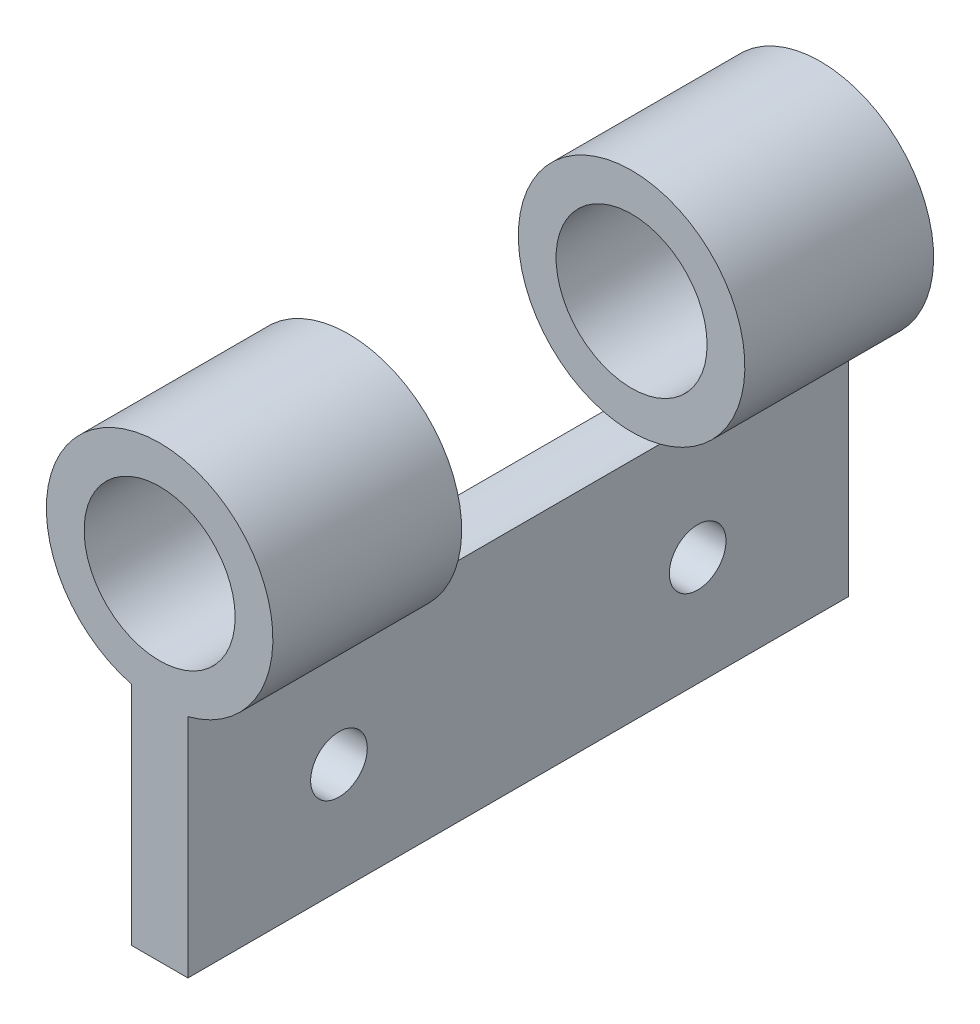
ISO-10303-21;
HEADER;
FILE_DESCRIPTION(('STEP AP214'),'2;1');
FILE_NAME('part.step','',(''),(''),'','','');
FILE_SCHEMA(('AUTOMOTIVE_DESIGN { 1 0 10303 214 1 1 1 1 }'));
ENDSEC;
DATA;
#1=APPLICATION_CONTEXT('core data for automotive mechanical design processes');
#2=APPLICATION_PROTOCOL_DEFINITION('international standard','automotive_design',2000,#1);
#3=PRODUCT_CONTEXT('',#1,'mechanical');
#4=PRODUCT('Part','Part','',(#3));
#5=PRODUCT_RELATED_PRODUCT_CATEGORY('part','',(#4));
#6=PRODUCT_DEFINITION_FORMATION('','',#4);
#7=PRODUCT_DEFINITION_CONTEXT('part definition',#1,'design');
#8=PRODUCT_DEFINITION('design','',#6,#7);
#9=PRODUCT_DEFINITION_SHAPE('','',#8);
#10=(LENGTH_UNIT() NAMED_UNIT(*) SI_UNIT(.MILLI.,.METRE.));
#11=(NAMED_UNIT(*) PLANE_ANGLE_UNIT() SI_UNIT($,.RADIAN.));
#12=(NAMED_UNIT(*) SI_UNIT($,.STERADIAN.) SOLID_ANGLE_UNIT());
#13=UNCERTAINTY_MEASURE_WITH_UNIT(LENGTH_MEASURE(1.E-05),#10,'distance_accuracy_value','');
#14=(GEOMETRIC_REPRESENTATION_CONTEXT(3) GLOBAL_UNCERTAINTY_ASSIGNED_CONTEXT((#13)) GLOBAL_UNIT_ASSIGNED_CONTEXT((#10,
#11,#12)) REPRESENTATION_CONTEXT('',''));
#15=CARTESIAN_POINT('',(0.,0.,0.));
#16=DIRECTION('',(0.,0.,1.));
#17=DIRECTION('',(1.,0.,0.));
#18=AXIS2_PLACEMENT_3D('',#15,#16,#17);
#19=CARTESIAN_POINT('',(0.,0.,-17.5));
#20=DIRECTION('',(0.,0.,1.));
#21=DIRECTION('',(1.,0.,0.));
#22=AXIS2_PLACEMENT_3D('',#19,#20,#21);
#23=CYLINDRICAL_SURFACE('',#22,3.);
#24=DIRECTION('',(0.,0.,1.));
#25=VECTOR('',#24,1.);
#26=CARTESIAN_POINT('',(-0.75,-2.90473750965556,-17.5));
#27=LINE('',#26,#25);
#28=CARTESIAN_POINT('',(-0.75,-2.90473750965556,-17.5));
#29=VERTEX_POINT('',#28);
#30=CARTESIAN_POINT('',(-0.75,-2.90473750965556,-12.5));
#31=VERTEX_POINT('',#30);
#32=EDGE_CURVE('E114',#29,#31,#27,.T.);
#33=ORIENTED_EDGE('',*,*,#32,.T.);
#34=CARTESIAN_POINT('',(0.,0.,-12.5));
#35=DIRECTION('',(0.,0.,1.));
#36=DIRECTION('',(1.,0.,0.));
#37=AXIS2_PLACEMENT_3D('',#34,#35,#36);
#38=CIRCLE('',#37,3.);
#39=CARTESIAN_POINT('',(0.75,-2.90473750965556,-12.5));
#40=VERTEX_POINT('',#39);
#41=EDGE_CURVE('E168',#40,#31,#38,.T.);
#42=ORIENTED_EDGE('',*,*,#41,.F.);
#43=DIRECTION('',(0.,0.,1.));
#44=VECTOR('',#43,1.);
#45=CARTESIAN_POINT('',(0.75,-2.90473750965556,-17.5));
#46=LINE('',#45,#44);
#47=CARTESIAN_POINT('',(0.75,-2.90473750965556,-17.5));
#48=VERTEX_POINT('',#47);
#49=EDGE_CURVE('E12',#48,#40,#46,.T.);
#50=ORIENTED_EDGE('',*,*,#49,.F.);
#51=CARTESIAN_POINT('',(0.,0.,-17.5));
#52=DIRECTION('',(0.,0.,1.));
#53=DIRECTION('',(1.,0.,0.));
#54=AXIS2_PLACEMENT_3D('',#51,#52,#53);
#55=CIRCLE('',#54,3.);
#56=EDGE_CURVE('E177',#48,#29,#55,.T.);
#57=ORIENTED_EDGE('',*,*,#56,.T.);
#58=EDGE_LOOP('',(#33,#42,#50,#57));
#59=FACE_BOUND('',#58,.T.);
#60=ADVANCED_FACE('F60',(#59),#23,.T.);
#61=CARTESIAN_POINT('',(0.,0.,-17.5));
#62=DIRECTION('',(0.,0.,1.));
#63=DIRECTION('',(1.,0.,0.));
#64=AXIS2_PLACEMENT_3D('',#61,#62,#63);
#65=CYLINDRICAL_SURFACE('',#64,2.);
#66=CARTESIAN_POINT('',(0.,0.,-17.5));
#67=DIRECTION('',(0.,0.,1.));
#68=DIRECTION('',(1.,0.,0.));
#69=AXIS2_PLACEMENT_3D('',#66,#67,#68);
#70=CIRCLE('',#69,2.);
#71=CARTESIAN_POINT('',(2.,0.,-17.5));
#72=VERTEX_POINT('',#71);
#73=EDGE_CURVE('E174',#72,#72,#70,.T.);
#74=ORIENTED_EDGE('',*,*,#73,.F.);
#75=EDGE_LOOP('',(#74));
#76=FACE_BOUND('',#75,.T.);
#77=CARTESIAN_POINT('',(0.,0.,-12.5));
#78=DIRECTION('',(0.,0.,1.));
#79=DIRECTION('',(1.,0.,0.));
#80=AXIS2_PLACEMENT_3D('',#77,#78,#79);
#81=CIRCLE('',#80,2.);
#82=CARTESIAN_POINT('',(2.,0.,-12.5));
#83=VERTEX_POINT('',#82);
#84=EDGE_CURVE('E136',#83,#83,#81,.T.);
#85=ORIENTED_EDGE('',*,*,#84,.T.);
#86=EDGE_LOOP('',(#85));
#87=FACE_BOUND('',#86,.T.);
#88=ADVANCED_FACE('F220',(#76,#87),#65,.F.);
#89=CARTESIAN_POINT('',(0.,-8.9,-17.5));
#90=DIRECTION('',(0.,-1.,0.));
#91=DIRECTION('',(0.,0.,-1.));
#92=AXIS2_PLACEMENT_3D('',#89,#90,#91);
#93=PLANE('',#92);
#94=DIRECTION('',(1.,0.,0.));
#95=VECTOR('',#94,1.);
#96=CARTESIAN_POINT('',(0.,-8.9,0.));
#97=LINE('',#96,#95);
#98=CARTESIAN_POINT('',(-0.75,-8.9,0.));
#99=VERTEX_POINT('',#98);
#100=CARTESIAN_POINT('',(0.75,-8.9,0.));
#101=VERTEX_POINT('',#100);
#102=EDGE_CURVE('E191',#99,#101,#97,.T.);
#103=ORIENTED_EDGE('',*,*,#102,.F.);
#104=DIRECTION('',(0.,0.,1.));
#105=VECTOR('',#104,1.);
#106=CARTESIAN_POINT('',(-0.75,-8.9,-17.5));
#107=LINE('',#106,#105);
#108=CARTESIAN_POINT('',(-0.75,-8.9,-17.5));
#109=VERTEX_POINT('',#108);
#110=EDGE_CURVE('E149',#109,#99,#107,.T.);
#111=ORIENTED_EDGE('',*,*,#110,.F.);
#112=DIRECTION('',(1.,0.,0.));
#113=VECTOR('',#112,1.);
#114=CARTESIAN_POINT('',(0.,-8.9,-17.5));
#115=LINE('',#114,#113);
#116=CARTESIAN_POINT('',(0.75,-8.9,-17.5));
#117=VERTEX_POINT('',#116);
#118=EDGE_CURVE('E181',#109,#117,#115,.T.);
#119=ORIENTED_EDGE('',*,*,#118,.T.);
#120=DIRECTION('',(0.,0.,1.));
#121=VECTOR('',#120,1.);
#122=CARTESIAN_POINT('',(0.75,-8.9,-17.5));
#123=LINE('',#122,#121);
#124=EDGE_CURVE('E141',#117,#101,#123,.T.);
#125=ORIENTED_EDGE('',*,*,#124,.T.);
#126=EDGE_LOOP('',(#103,#111,#119,#125));
#127=FACE_BOUND('',#126,.T.);
#128=ADVANCED_FACE('F201',(#127),#93,.T.);
#129=CARTESIAN_POINT('',(0.,0.,0.));
#130=DIRECTION('',(0.,0.,1.));
#131=DIRECTION('',(1.,0.,0.));
#132=AXIS2_PLACEMENT_3D('',#129,#130,#131);
#133=PLANE('',#132);
#134=DIRECTION('',(0.,1.,0.));
#135=VECTOR('',#134,1.);
#136=CARTESIAN_POINT('',(0.75,0.,0.));
#137=LINE('',#136,#135);
#138=CARTESIAN_POINT('',(0.75,-2.90473750965556,0.));
#139=VERTEX_POINT('',#138);
#140=EDGE_CURVE('E146',#101,#139,#137,.T.);
#141=ORIENTED_EDGE('',*,*,#140,.T.);
#142=CARTESIAN_POINT('',(0.,0.,0.));
#143=DIRECTION('',(0.,0.,1.));
#144=DIRECTION('',(1.,0.,0.));
#145=AXIS2_PLACEMENT_3D('',#142,#143,#144);
#146=CIRCLE('',#145,3.);
#147=CARTESIAN_POINT('',(-0.75,-2.90473750965556,0.));
#148=VERTEX_POINT('',#147);
#149=EDGE_CURVE('E139',#139,#148,#146,.T.);
#150=ORIENTED_EDGE('',*,*,#149,.T.);
#151=DIRECTION('',(0.,1.,0.));
#152=VECTOR('',#151,1.);
#153=CARTESIAN_POINT('',(-0.75,0.,0.));
#154=LINE('',#153,#152);
#155=EDGE_CURVE('E189',#99,#148,#154,.T.);
#156=ORIENTED_EDGE('',*,*,#155,.F.);
#157=ORIENTED_EDGE('',*,*,#102,.T.);
#158=EDGE_LOOP('',(#141,#150,#156,#157));
#159=FACE_BOUND('',#158,.T.);
#160=CARTESIAN_POINT('',(0.,0.,0.));
#161=DIRECTION('',(0.,0.,1.));
#162=DIRECTION('',(1.,0.,0.));
#163=AXIS2_PLACEMENT_3D('',#160,#161,#162);
#164=CIRCLE('',#163,2.);
#165=CARTESIAN_POINT('',(2.,0.,0.));
#166=VERTEX_POINT('',#165);
#167=EDGE_CURVE('E171',#166,#166,#164,.T.);
#168=ORIENTED_EDGE('',*,*,#167,.F.);
#169=EDGE_LOOP('',(#168));
#170=FACE_BOUND('',#169,.T.);
#171=ADVANCED_FACE('F196',(#159,#170),#133,.T.);
#172=CARTESIAN_POINT('',(0.75,0.,-17.5));
#173=DIRECTION('',(1.,0.,0.));
#174=DIRECTION('',(0.,0.,-1.));
#175=AXIS2_PLACEMENT_3D('',#172,#173,#174);
#176=PLANE('',#175);
#177=CARTESIAN_POINT('',(0.75,-6.,-4.));
#178=DIRECTION('',(1.,0.,0.));
#179=DIRECTION('',(0.,0.,-1.));
#180=AXIS2_PLACEMENT_3D('',#177,#178,#179);
#181=CIRCLE('',#180,0.75);
#182=CARTESIAN_POINT('',(0.75,-6.,-4.75));
#183=VERTEX_POINT('',#182);
#184=EDGE_CURVE('E154',#183,#183,#181,.T.);
#185=ORIENTED_EDGE('',*,*,#184,.F.);
#186=EDGE_LOOP('',(#185));
#187=FACE_BOUND('',#186,.T.);
#188=CARTESIAN_POINT('',(0.75,-6.,-13.5));
#189=DIRECTION('',(1.,0.,0.));
#190=DIRECTION('',(0.,0.,-1.));
#191=AXIS2_PLACEMENT_3D('',#188,#189,#190);
#192=CIRCLE('',#191,0.75);
#193=CARTESIAN_POINT('',(0.75,-6.,-14.25));
#194=VERTEX_POINT('',#193);
#195=EDGE_CURVE('E159',#194,#194,#192,.T.);
#196=ORIENTED_EDGE('',*,*,#195,.F.);
#197=EDGE_LOOP('',(#196));
#198=FACE_BOUND('',#197,.T.);
#199=ORIENTED_EDGE('',*,*,#140,.F.);
#200=ORIENTED_EDGE('',*,*,#124,.F.);
#201=DIRECTION('',(0.,1.,0.));
#202=VECTOR('',#201,1.);
#203=CARTESIAN_POINT('',(0.75,0.,-17.5));
#204=LINE('',#203,#202);
#205=EDGE_CURVE('E184',#117,#48,#204,.T.);
#206=ORIENTED_EDGE('',*,*,#205,.T.);
#207=ORIENTED_EDGE('',*,*,#49,.T.);
#208=CARTESIAN_POINT('',(0.75,-2.90473750965556,-5.));
#209=VERTEX_POINT('',#208);
#210=EDGE_CURVE('E69',#40,#209,#46,.T.);
#211=ORIENTED_EDGE('',*,*,#210,.T.);
#212=EDGE_CURVE('E71',#209,#139,#46,.T.);
#213=ORIENTED_EDGE('',*,*,#212,.T.);
#214=EDGE_LOOP('',(#199,#200,#206,#207,#211,#213));
#215=FACE_BOUND('',#214,.T.);
#216=ADVANCED_FACE('F142',(#187,#198,#215),#176,.T.);
#217=CARTESIAN_POINT('',(-0.75,0.,-17.5));
#218=DIRECTION('',(1.,0.,0.));
#219=DIRECTION('',(0.,0.,-1.));
#220=AXIS2_PLACEMENT_3D('',#217,#218,#219);
#221=PLANE('',#220);
#222=CARTESIAN_POINT('',(-0.750000000000001,-6.,-4.));
#223=DIRECTION('',(1.,0.,0.));
#224=DIRECTION('',(0.,0.,-1.));
#225=AXIS2_PLACEMENT_3D('',#222,#223,#224);
#226=CIRCLE('',#225,0.75);
#227=CARTESIAN_POINT('',(-0.750000000000001,-6.,-4.75));
#228=VERTEX_POINT('',#227);
#229=EDGE_CURVE('E64',#228,#228,#226,.T.);
#230=ORIENTED_EDGE('',*,*,#229,.T.);
#231=EDGE_LOOP('',(#230));
#232=FACE_BOUND('',#231,.T.);
#233=CARTESIAN_POINT('',(-0.750000000000001,-6.,-13.5));
#234=DIRECTION('',(1.,0.,0.));
#235=DIRECTION('',(0.,0.,-1.));
#236=AXIS2_PLACEMENT_3D('',#233,#234,#235);
#237=CIRCLE('',#236,0.75);
#238=CARTESIAN_POINT('',(-0.750000000000001,-6.,-14.25));
#239=VERTEX_POINT('',#238);
#240=EDGE_CURVE('E152',#239,#239,#237,.T.);
#241=ORIENTED_EDGE('',*,*,#240,.T.);
#242=EDGE_LOOP('',(#241));
#243=FACE_BOUND('',#242,.T.);
#244=ORIENTED_EDGE('',*,*,#155,.T.);
#245=CARTESIAN_POINT('',(-0.75,-2.90473750965556,-5.));
#246=VERTEX_POINT('',#245);
#247=EDGE_CURVE('E151',#246,#148,#27,.T.);
#248=ORIENTED_EDGE('',*,*,#247,.F.);
#249=EDGE_CURVE('E135',#31,#246,#27,.T.);
#250=ORIENTED_EDGE('',*,*,#249,.F.);
#251=ORIENTED_EDGE('',*,*,#32,.F.);
#252=DIRECTION('',(0.,1.,0.));
#253=VECTOR('',#252,1.);
#254=CARTESIAN_POINT('',(-0.75,0.,-17.5));
#255=LINE('',#254,#253);
#256=EDGE_CURVE('E179',#109,#29,#255,.T.);
#257=ORIENTED_EDGE('',*,*,#256,.F.);
#258=ORIENTED_EDGE('',*,*,#110,.T.);
#259=EDGE_LOOP('',(#244,#248,#250,#251,#257,#258));
#260=FACE_BOUND('',#259,.T.);
#261=ADVANCED_FACE('F207',(#232,#243,#260),#221,.F.);
#262=CARTESIAN_POINT('',(0.,0.,-17.5));
#263=DIRECTION('',(0.,0.,1.));
#264=DIRECTION('',(1.,0.,0.));
#265=AXIS2_PLACEMENT_3D('',#262,#263,#264);
#266=PLANE('',#265);
#267=ORIENTED_EDGE('',*,*,#56,.F.);
#268=ORIENTED_EDGE('',*,*,#205,.F.);
#269=ORIENTED_EDGE('',*,*,#118,.F.);
#270=ORIENTED_EDGE('',*,*,#256,.T.);
#271=EDGE_LOOP('',(#267,#268,#269,#270));
#272=FACE_BOUND('',#271,.T.);
#273=ORIENTED_EDGE('',*,*,#73,.T.);
#274=EDGE_LOOP('',(#273));
#275=FACE_BOUND('',#274,.T.);
#276=ADVANCED_FACE('F203',(#272,#275),#266,.F.);
#277=CARTESIAN_POINT('',(0.,0.,-5.));
#278=DIRECTION('',(0.,0.,1.));
#279=DIRECTION('',(1.,0.,0.));
#280=AXIS2_PLACEMENT_3D('',#277,#278,#279);
#281=CIRCLE('',#280,3.);
#282=EDGE_CURVE('E125',#209,#246,#281,.T.);
#283=ORIENTED_EDGE('',*,*,#282,.T.);
#284=ORIENTED_EDGE('',*,*,#247,.T.);
#285=ORIENTED_EDGE('',*,*,#149,.F.);
#286=ORIENTED_EDGE('',*,*,#212,.F.);
#287=EDGE_LOOP('',(#283,#284,#285,#286));
#288=FACE_BOUND('',#287,.T.);
#289=ADVANCED_FACE('F137',(#288),#23,.T.);
#290=CARTESIAN_POINT('',(0.,0.,-5.));
#291=DIRECTION('',(0.,0.,1.));
#292=DIRECTION('',(1.,0.,0.));
#293=AXIS2_PLACEMENT_3D('',#290,#291,#292);
#294=CIRCLE('',#293,2.);
#295=CARTESIAN_POINT('',(2.,0.,-5.));
#296=VERTEX_POINT('',#295);
#297=EDGE_CURVE('E129',#296,#296,#294,.T.);
#298=ORIENTED_EDGE('',*,*,#297,.F.);
#299=EDGE_LOOP('',(#298));
#300=FACE_BOUND('',#299,.T.);
#301=ORIENTED_EDGE('',*,*,#167,.T.);
#302=EDGE_LOOP('',(#301));
#303=FACE_BOUND('',#302,.T.);
#304=ADVANCED_FACE('F62',(#300,#303),#65,.F.);
#305=CARTESIAN_POINT('',(0.,0.,-12.5));
#306=DIRECTION('',(0.,0.,1.));
#307=DIRECTION('',(1.,0.,0.));
#308=AXIS2_PLACEMENT_3D('',#305,#306,#307);
#309=CYLINDRICAL_SURFACE('',#308,3.);
#310=ORIENTED_EDGE('',*,*,#210,.F.);
#311=EDGE_CURVE('E169',#31,#40,#38,.T.);
#312=ORIENTED_EDGE('',*,*,#311,.F.);
#313=ORIENTED_EDGE('',*,*,#249,.T.);
#314=EDGE_CURVE('E77',#246,#209,#281,.T.);
#315=ORIENTED_EDGE('',*,*,#314,.T.);
#316=EDGE_LOOP('',(#310,#312,#313,#315));
#317=FACE_BOUND('',#316,.T.);
#318=ADVANCED_FACE('F132',(#317),#309,.F.);
#319=CARTESIAN_POINT('',(0.,0.,-12.5));
#320=DIRECTION('',(0.,0.,1.));
#321=DIRECTION('',(1.,0.,0.));
#322=AXIS2_PLACEMENT_3D('',#319,#320,#321);
#323=PLANE('',#322);
#324=ORIENTED_EDGE('',*,*,#84,.F.);
#325=EDGE_LOOP('',(#324));
#326=FACE_BOUND('',#325,.T.);
#327=ORIENTED_EDGE('',*,*,#311,.T.);
#328=ORIENTED_EDGE('',*,*,#41,.T.);
#329=EDGE_LOOP('',(#327,#328));
#330=FACE_BOUND('',#329,.T.);
#331=ADVANCED_FACE('F206',(#326,#330),#323,.T.);
#332=CARTESIAN_POINT('',(0.,0.,-5.));
#333=DIRECTION('',(0.,0.,1.));
#334=DIRECTION('',(1.,0.,0.));
#335=AXIS2_PLACEMENT_3D('',#332,#333,#334);
#336=PLANE('',#335);
#337=ORIENTED_EDGE('',*,*,#297,.T.);
#338=EDGE_LOOP('',(#337));
#339=FACE_BOUND('',#338,.T.);
#340=ORIENTED_EDGE('',*,*,#314,.F.);
#341=ORIENTED_EDGE('',*,*,#282,.F.);
#342=EDGE_LOOP('',(#340,#341));
#343=FACE_BOUND('',#342,.T.);
#344=ADVANCED_FACE('F126',(#339,#343),#336,.F.);
#345=CARTESIAN_POINT('',(-9.25,-6.,-13.5));
#346=DIRECTION('',(1.,0.,0.));
#347=DIRECTION('',(0.,0.,-1.));
#348=AXIS2_PLACEMENT_3D('',#345,#346,#347);
#349=CYLINDRICAL_SURFACE('',#348,0.75);
#350=ORIENTED_EDGE('',*,*,#195,.T.);
#351=EDGE_LOOP('',(#350));
#352=FACE_BOUND('',#351,.T.);
#353=ORIENTED_EDGE('',*,*,#240,.F.);
#354=EDGE_LOOP('',(#353));
#355=FACE_BOUND('',#354,.T.);
#356=ADVANCED_FACE('F240',(#352,#355),#349,.F.);
#357=CARTESIAN_POINT('',(-9.25,-6.,-4.));
#358=DIRECTION('',(1.,0.,0.));
#359=DIRECTION('',(0.,0.,-1.));
#360=AXIS2_PLACEMENT_3D('',#357,#358,#359);
#361=CYLINDRICAL_SURFACE('',#360,0.75);
#362=ORIENTED_EDGE('',*,*,#184,.T.);
#363=EDGE_LOOP('',(#362));
#364=FACE_BOUND('',#363,.T.);
#365=ORIENTED_EDGE('',*,*,#229,.F.);
#366=EDGE_LOOP('',(#365));
#367=FACE_BOUND('',#366,.T.);
#368=ADVANCED_FACE('F247',(#364,#367),#361,.F.);
#369=CLOSED_SHELL('',(#60,#88,#128,#171,#216,#261,#276,#289,#304,#318,#331,#344,#356,#368));
#370=MANIFOLD_SOLID_BREP('B2',#369);
#371=ADVANCED_BREP_SHAPE_REPRESENTATION('',(#18,#370),#14);
#372=SHAPE_DEFINITION_REPRESENTATION(#9,#371);
ENDSEC;
END-ISO-10303-21;
